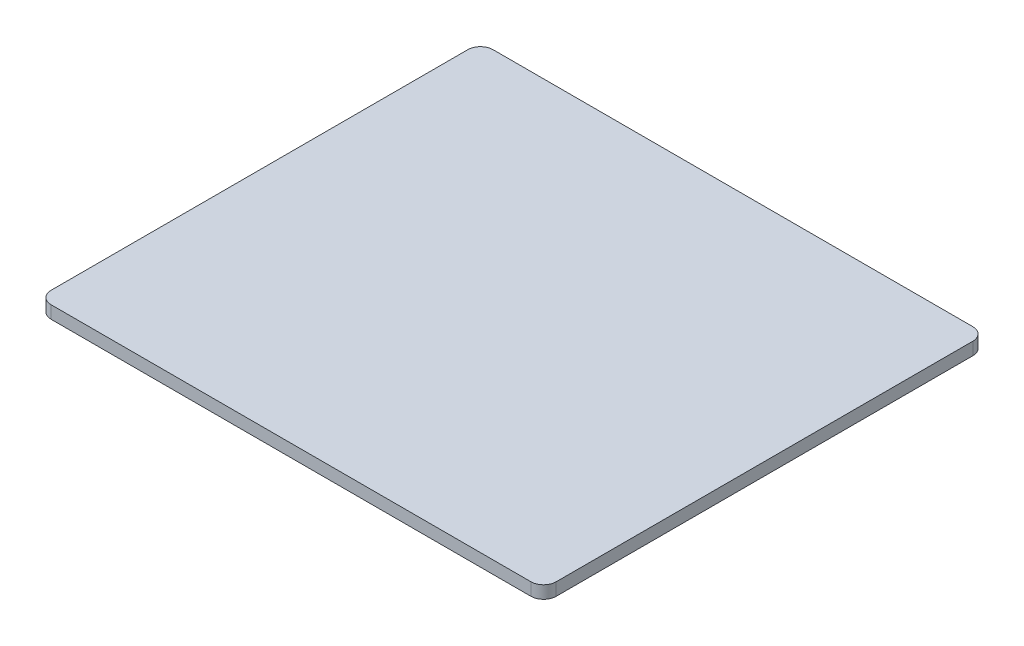
ISO-10303-21;
HEADER;
FILE_DESCRIPTION(('STEP AP214'),'2;1');
FILE_NAME('part.step','',(''),(''),'','','');
FILE_SCHEMA(('AUTOMOTIVE_DESIGN { 1 0 10303 214 1 1 1 1 }'));
ENDSEC;
DATA;
#1=APPLICATION_CONTEXT('core data for automotive mechanical design processes');
#2=APPLICATION_PROTOCOL_DEFINITION('international standard','automotive_design',2000,#1);
#3=PRODUCT_CONTEXT('',#1,'mechanical');
#4=PRODUCT('Part','Part','',(#3));
#5=PRODUCT_RELATED_PRODUCT_CATEGORY('part','',(#4));
#6=PRODUCT_DEFINITION_FORMATION('','',#4);
#7=PRODUCT_DEFINITION_CONTEXT('part definition',#1,'design');
#8=PRODUCT_DEFINITION('design','',#6,#7);
#9=PRODUCT_DEFINITION_SHAPE('','',#8);
#10=(LENGTH_UNIT() NAMED_UNIT(*) SI_UNIT(.MILLI.,.METRE.));
#11=(NAMED_UNIT(*) PLANE_ANGLE_UNIT() SI_UNIT($,.RADIAN.));
#12=(NAMED_UNIT(*) SI_UNIT($,.STERADIAN.) SOLID_ANGLE_UNIT());
#13=UNCERTAINTY_MEASURE_WITH_UNIT(LENGTH_MEASURE(1.E-05),#10,'distance_accuracy_value','');
#14=(GEOMETRIC_REPRESENTATION_CONTEXT(3) GLOBAL_UNCERTAINTY_ASSIGNED_CONTEXT((#13)) GLOBAL_UNIT_ASSIGNED_CONTEXT((#10,
#11,#12)) REPRESENTATION_CONTEXT('',''));
#15=CARTESIAN_POINT('',(0.,0.,0.));
#16=DIRECTION('',(0.,0.,1.));
#17=DIRECTION('',(1.,0.,0.));
#18=AXIS2_PLACEMENT_3D('',#15,#16,#17);
#19=CARTESIAN_POINT('',(200.,10.,-175.));
#20=DIRECTION('',(-1.,0.,0.));
#21=DIRECTION('',(0.,0.,1.));
#22=AXIS2_PLACEMENT_3D('',#19,#20,#21);
#23=PLANE('',#22);
#24=DIRECTION('',(0.,0.,-1.));
#25=VECTOR('',#24,1.);
#26=CARTESIAN_POINT('',(200.,0.,-175.));
#27=LINE('',#26,#25);
#28=CARTESIAN_POINT('',(200.,0.,165.));
#29=VERTEX_POINT('',#28);
#30=CARTESIAN_POINT('',(200.,0.,-165.));
#31=VERTEX_POINT('',#30);
#32=EDGE_CURVE('E128',#29,#31,#27,.T.);
#33=ORIENTED_EDGE('',*,*,#32,.T.);
#34=DIRECTION('',(0.,-1.,0.));
#35=VECTOR('',#34,1.);
#36=CARTESIAN_POINT('',(200.,10.,-165.));
#37=LINE('',#36,#35);
#38=CARTESIAN_POINT('',(200.,10.,-165.));
#39=VERTEX_POINT('',#38);
#40=EDGE_CURVE('E151',#31,#39,#37,.F.);
#41=ORIENTED_EDGE('',*,*,#40,.T.);
#42=DIRECTION('',(0.,0.,-1.));
#43=VECTOR('',#42,1.);
#44=CARTESIAN_POINT('',(200.,10.,-175.));
#45=LINE('',#44,#43);
#46=CARTESIAN_POINT('',(200.,10.,165.));
#47=VERTEX_POINT('',#46);
#48=EDGE_CURVE('E126',#47,#39,#45,.T.);
#49=ORIENTED_EDGE('',*,*,#48,.F.);
#50=DIRECTION('',(0.,-1.,0.));
#51=VECTOR('',#50,1.);
#52=CARTESIAN_POINT('',(200.,10.,165.));
#53=LINE('',#52,#51);
#54=EDGE_CURVE('E148',#47,#29,#53,.T.);
#55=ORIENTED_EDGE('',*,*,#54,.T.);
#56=EDGE_LOOP('',(#33,#41,#49,#55));
#57=FACE_BOUND('',#56,.T.);
#58=ADVANCED_FACE('F33',(#57),#23,.F.);
#59=CARTESIAN_POINT('',(-200.,10.,-175.));
#60=DIRECTION('',(0.,0.,1.));
#61=DIRECTION('',(1.,0.,0.));
#62=AXIS2_PLACEMENT_3D('',#59,#60,#61);
#63=PLANE('',#62);
#64=DIRECTION('',(-1.,0.,0.));
#65=VECTOR('',#64,1.);
#66=CARTESIAN_POINT('',(-200.,0.,-175.));
#67=LINE('',#66,#65);
#68=CARTESIAN_POINT('',(190.,0.,-175.));
#69=VERTEX_POINT('',#68);
#70=CARTESIAN_POINT('',(-190.,0.,-175.));
#71=VERTEX_POINT('',#70);
#72=EDGE_CURVE('E124',#69,#71,#67,.T.);
#73=ORIENTED_EDGE('',*,*,#72,.T.);
#74=DIRECTION('',(0.,-1.,0.));
#75=VECTOR('',#74,1.);
#76=CARTESIAN_POINT('',(-190.,10.,-175.));
#77=LINE('',#76,#75);
#78=CARTESIAN_POINT('',(-190.,10.,-175.));
#79=VERTEX_POINT('',#78);
#80=EDGE_CURVE('E103',#71,#79,#77,.F.);
#81=ORIENTED_EDGE('',*,*,#80,.T.);
#82=DIRECTION('',(-1.,0.,0.));
#83=VECTOR('',#82,1.);
#84=CARTESIAN_POINT('',(-200.,10.,-175.));
#85=LINE('',#84,#83);
#86=CARTESIAN_POINT('',(190.,10.,-175.));
#87=VERTEX_POINT('',#86);
#88=EDGE_CURVE('E167',#87,#79,#85,.T.);
#89=ORIENTED_EDGE('',*,*,#88,.F.);
#90=DIRECTION('',(0.,-1.,0.));
#91=VECTOR('',#90,1.);
#92=CARTESIAN_POINT('',(190.,10.,-175.));
#93=LINE('',#92,#91);
#94=EDGE_CURVE('E108',#87,#69,#93,.T.);
#95=ORIENTED_EDGE('',*,*,#94,.T.);
#96=EDGE_LOOP('',(#73,#81,#89,#95));
#97=FACE_BOUND('',#96,.T.);
#98=ADVANCED_FACE('F184',(#97),#63,.F.);
#99=CARTESIAN_POINT('',(-200.,10.,-175.));
#100=DIRECTION('',(1.,0.,0.));
#101=DIRECTION('',(0.,0.,-1.));
#102=AXIS2_PLACEMENT_3D('',#99,#100,#101);
#103=PLANE('',#102);
#104=DIRECTION('',(0.,0.,1.));
#105=VECTOR('',#104,1.);
#106=CARTESIAN_POINT('',(-200.,10.,-175.));
#107=LINE('',#106,#105);
#108=CARTESIAN_POINT('',(-200.,10.,-165.));
#109=VERTEX_POINT('',#108);
#110=CARTESIAN_POINT('',(-200.,10.,165.));
#111=VERTEX_POINT('',#110);
#112=EDGE_CURVE('E117',#109,#111,#107,.T.);
#113=ORIENTED_EDGE('',*,*,#112,.F.);
#114=DIRECTION('',(0.,-1.,0.));
#115=VECTOR('',#114,1.);
#116=CARTESIAN_POINT('',(-200.,10.,-165.));
#117=LINE('',#116,#115);
#118=CARTESIAN_POINT('',(-200.,0.,-165.));
#119=VERTEX_POINT('',#118);
#120=EDGE_CURVE('E102',#109,#119,#117,.T.);
#121=ORIENTED_EDGE('',*,*,#120,.T.);
#122=DIRECTION('',(0.,0.,1.));
#123=VECTOR('',#122,1.);
#124=CARTESIAN_POINT('',(-200.,0.,-175.));
#125=LINE('',#124,#123);
#126=CARTESIAN_POINT('',(-200.,0.,165.));
#127=VERTEX_POINT('',#126);
#128=EDGE_CURVE('E115',#119,#127,#125,.T.);
#129=ORIENTED_EDGE('',*,*,#128,.T.);
#130=DIRECTION('',(0.,-1.,0.));
#131=VECTOR('',#130,1.);
#132=CARTESIAN_POINT('',(-200.,10.,165.));
#133=LINE('',#132,#131);
#134=EDGE_CURVE('E119',#127,#111,#133,.F.);
#135=ORIENTED_EDGE('',*,*,#134,.T.);
#136=EDGE_LOOP('',(#113,#121,#129,#135));
#137=FACE_BOUND('',#136,.T.);
#138=ADVANCED_FACE('F114',(#137),#103,.F.);
#139=CARTESIAN_POINT('',(-200.,10.,175.));
#140=DIRECTION('',(0.,0.,-1.));
#141=DIRECTION('',(-1.,0.,0.));
#142=AXIS2_PLACEMENT_3D('',#139,#140,#141);
#143=PLANE('',#142);
#144=DIRECTION('',(1.,0.,0.));
#145=VECTOR('',#144,1.);
#146=CARTESIAN_POINT('',(-200.,0.,175.));
#147=LINE('',#146,#145);
#148=CARTESIAN_POINT('',(-190.,0.,175.));
#149=VERTEX_POINT('',#148);
#150=CARTESIAN_POINT('',(190.,0.,175.));
#151=VERTEX_POINT('',#150);
#152=EDGE_CURVE('E123',#149,#151,#147,.T.);
#153=ORIENTED_EDGE('',*,*,#152,.T.);
#154=DIRECTION('',(0.,-1.,0.));
#155=VECTOR('',#154,1.);
#156=CARTESIAN_POINT('',(190.,10.,175.));
#157=LINE('',#156,#155);
#158=CARTESIAN_POINT('',(190.,10.,175.));
#159=VERTEX_POINT('',#158);
#160=EDGE_CURVE('E11',#151,#159,#157,.F.);
#161=ORIENTED_EDGE('',*,*,#160,.T.);
#162=DIRECTION('',(1.,0.,0.));
#163=VECTOR('',#162,1.);
#164=CARTESIAN_POINT('',(-200.,10.,175.));
#165=LINE('',#164,#163);
#166=CARTESIAN_POINT('',(-190.,10.,175.));
#167=VERTEX_POINT('',#166);
#168=EDGE_CURVE('E132',#167,#159,#165,.T.);
#169=ORIENTED_EDGE('',*,*,#168,.F.);
#170=DIRECTION('',(0.,-1.,0.));
#171=VECTOR('',#170,1.);
#172=CARTESIAN_POINT('',(-190.,10.,175.));
#173=LINE('',#172,#171);
#174=EDGE_CURVE('E41',#167,#149,#173,.T.);
#175=ORIENTED_EDGE('',*,*,#174,.T.);
#176=EDGE_LOOP('',(#153,#161,#169,#175));
#177=FACE_BOUND('',#176,.T.);
#178=ADVANCED_FACE('F154',(#177),#143,.F.);
#179=CARTESIAN_POINT('',(0.,10.,0.));
#180=DIRECTION('',(0.,1.,0.));
#181=DIRECTION('',(0.,0.,1.));
#182=AXIS2_PLACEMENT_3D('',#179,#180,#181);
#183=PLANE('',#182);
#184=ORIENTED_EDGE('',*,*,#88,.T.);
#185=CARTESIAN_POINT('',(-190.,10.,-165.));
#186=DIRECTION('',(0.,1.,0.));
#187=DIRECTION('',(0.,0.,1.));
#188=AXIS2_PLACEMENT_3D('',#185,#186,#187);
#189=CIRCLE('',#188,10.);
#190=EDGE_CURVE('E146',#79,#109,#189,.T.);
#191=ORIENTED_EDGE('',*,*,#190,.T.);
#192=ORIENTED_EDGE('',*,*,#112,.T.);
#193=CARTESIAN_POINT('',(-190.,10.,165.));
#194=DIRECTION('',(0.,1.,0.));
#195=DIRECTION('',(0.,0.,1.));
#196=AXIS2_PLACEMENT_3D('',#193,#194,#195);
#197=CIRCLE('',#196,10.);
#198=EDGE_CURVE('E53',#111,#167,#197,.T.);
#199=ORIENTED_EDGE('',*,*,#198,.T.);
#200=ORIENTED_EDGE('',*,*,#168,.T.);
#201=CARTESIAN_POINT('',(190.,10.,165.));
#202=DIRECTION('',(0.,1.,0.));
#203=DIRECTION('',(0.,0.,1.));
#204=AXIS2_PLACEMENT_3D('',#201,#202,#203);
#205=CIRCLE('',#204,10.);
#206=EDGE_CURVE('E142',#159,#47,#205,.T.);
#207=ORIENTED_EDGE('',*,*,#206,.T.);
#208=ORIENTED_EDGE('',*,*,#48,.T.);
#209=CARTESIAN_POINT('',(190.,10.,-165.));
#210=DIRECTION('',(0.,1.,0.));
#211=DIRECTION('',(0.,0.,1.));
#212=AXIS2_PLACEMENT_3D('',#209,#210,#211);
#213=CIRCLE('',#212,10.);
#214=EDGE_CURVE('E144',#39,#87,#213,.T.);
#215=ORIENTED_EDGE('',*,*,#214,.T.);
#216=EDGE_LOOP('',(#184,#191,#192,#199,#200,#207,#208,#215));
#217=FACE_BOUND('',#216,.T.);
#218=ADVANCED_FACE('F173',(#217),#183,.T.);
#219=CARTESIAN_POINT('',(0.,0.,0.));
#220=DIRECTION('',(0.,1.,0.));
#221=DIRECTION('',(0.,0.,1.));
#222=AXIS2_PLACEMENT_3D('',#219,#220,#221);
#223=PLANE('',#222);
#224=ORIENTED_EDGE('',*,*,#128,.F.);
#225=CARTESIAN_POINT('',(-190.,0.,-165.));
#226=DIRECTION('',(0.,1.,0.));
#227=DIRECTION('',(0.,0.,1.));
#228=AXIS2_PLACEMENT_3D('',#225,#226,#227);
#229=CIRCLE('',#228,10.);
#230=EDGE_CURVE('E98',#119,#71,#229,.F.);
#231=ORIENTED_EDGE('',*,*,#230,.T.);
#232=ORIENTED_EDGE('',*,*,#72,.F.);
#233=CARTESIAN_POINT('',(190.,0.,-165.));
#234=DIRECTION('',(0.,1.,0.));
#235=DIRECTION('',(0.,0.,1.));
#236=AXIS2_PLACEMENT_3D('',#233,#234,#235);
#237=CIRCLE('',#236,10.);
#238=EDGE_CURVE('E109',#69,#31,#237,.F.);
#239=ORIENTED_EDGE('',*,*,#238,.T.);
#240=ORIENTED_EDGE('',*,*,#32,.F.);
#241=CARTESIAN_POINT('',(190.,0.,165.));
#242=DIRECTION('',(0.,1.,0.));
#243=DIRECTION('',(0.,0.,1.));
#244=AXIS2_PLACEMENT_3D('',#241,#242,#243);
#245=CIRCLE('',#244,10.);
#246=EDGE_CURVE('E135',#29,#151,#245,.F.);
#247=ORIENTED_EDGE('',*,*,#246,.T.);
#248=ORIENTED_EDGE('',*,*,#152,.F.);
#249=CARTESIAN_POINT('',(-190.,0.,165.));
#250=DIRECTION('',(0.,1.,0.));
#251=DIRECTION('',(0.,0.,1.));
#252=AXIS2_PLACEMENT_3D('',#249,#250,#251);
#253=CIRCLE('',#252,10.);
#254=EDGE_CURVE('E118',#149,#127,#253,.F.);
#255=ORIENTED_EDGE('',*,*,#254,.T.);
#256=EDGE_LOOP('',(#224,#231,#232,#239,#240,#247,#248,#255));
#257=FACE_BOUND('',#256,.T.);
#258=ADVANCED_FACE('F121',(#257),#223,.F.);
#259=CARTESIAN_POINT('',(-190.,10.,-165.));
#260=DIRECTION('',(0.,-1.,0.));
#261=DIRECTION('',(0.,0.,-1.));
#262=AXIS2_PLACEMENT_3D('',#259,#260,#261);
#263=CYLINDRICAL_SURFACE('',#262,10.);
#264=ORIENTED_EDGE('',*,*,#190,.F.);
#265=ORIENTED_EDGE('',*,*,#80,.F.);
#266=ORIENTED_EDGE('',*,*,#230,.F.);
#267=ORIENTED_EDGE('',*,*,#120,.F.);
#268=EDGE_LOOP('',(#264,#265,#266,#267));
#269=FACE_BOUND('',#268,.T.);
#270=ADVANCED_FACE('F101',(#269),#263,.T.);
#271=CARTESIAN_POINT('',(190.,10.,-165.));
#272=DIRECTION('',(0.,-1.,0.));
#273=DIRECTION('',(0.,0.,-1.));
#274=AXIS2_PLACEMENT_3D('',#271,#272,#273);
#275=CYLINDRICAL_SURFACE('',#274,10.);
#276=ORIENTED_EDGE('',*,*,#214,.F.);
#277=ORIENTED_EDGE('',*,*,#40,.F.);
#278=ORIENTED_EDGE('',*,*,#238,.F.);
#279=ORIENTED_EDGE('',*,*,#94,.F.);
#280=EDGE_LOOP('',(#276,#277,#278,#279));
#281=FACE_BOUND('',#280,.T.);
#282=ADVANCED_FACE('F195',(#281),#275,.T.);
#283=CARTESIAN_POINT('',(190.,10.,165.));
#284=DIRECTION('',(0.,-1.,0.));
#285=DIRECTION('',(0.,0.,-1.));
#286=AXIS2_PLACEMENT_3D('',#283,#284,#285);
#287=CYLINDRICAL_SURFACE('',#286,10.);
#288=ORIENTED_EDGE('',*,*,#206,.F.);
#289=ORIENTED_EDGE('',*,*,#160,.F.);
#290=ORIENTED_EDGE('',*,*,#246,.F.);
#291=ORIENTED_EDGE('',*,*,#54,.F.);
#292=EDGE_LOOP('',(#288,#289,#290,#291));
#293=FACE_BOUND('',#292,.T.);
#294=ADVANCED_FACE('F161',(#293),#287,.T.);
#295=CARTESIAN_POINT('',(-190.,10.,165.));
#296=DIRECTION('',(0.,-1.,0.));
#297=DIRECTION('',(0.,0.,-1.));
#298=AXIS2_PLACEMENT_3D('',#295,#296,#297);
#299=CYLINDRICAL_SURFACE('',#298,10.);
#300=ORIENTED_EDGE('',*,*,#198,.F.);
#301=ORIENTED_EDGE('',*,*,#134,.F.);
#302=ORIENTED_EDGE('',*,*,#254,.F.);
#303=ORIENTED_EDGE('',*,*,#174,.F.);
#304=EDGE_LOOP('',(#300,#301,#302,#303));
#305=FACE_BOUND('',#304,.T.);
#306=ADVANCED_FACE('F35',(#305),#299,.T.);
#307=CLOSED_SHELL('',(#58,#98,#138,#178,#218,#258,#270,#282,#294,#306));
#308=MANIFOLD_SOLID_BREP('B2',#307);
#309=ADVANCED_BREP_SHAPE_REPRESENTATION('',(#18,#308),#14);
#310=SHAPE_DEFINITION_REPRESENTATION(#9,#309);
ENDSEC;
END-ISO-10303-21;
